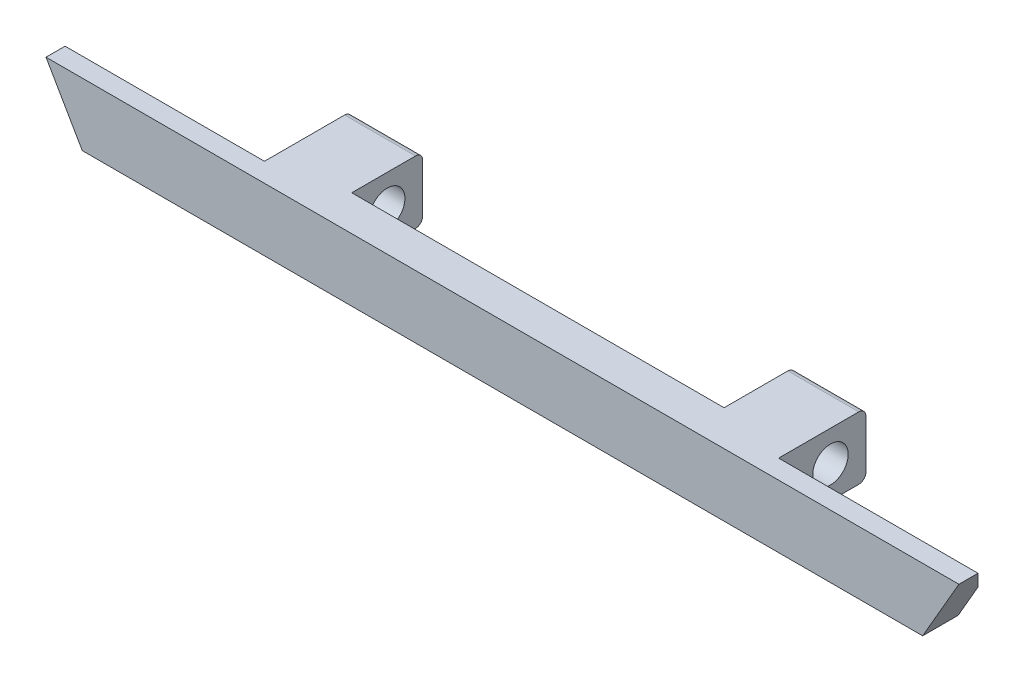
ISO-10303-21;
HEADER;
FILE_DESCRIPTION(('STEP AP214'),'2;1');
FILE_NAME('part.step','',(''),(''),'','','');
FILE_SCHEMA(('AUTOMOTIVE_DESIGN { 1 0 10303 214 1 1 1 1 }'));
ENDSEC;
DATA;
#1=APPLICATION_CONTEXT('core data for automotive mechanical design processes');
#2=APPLICATION_PROTOCOL_DEFINITION('international standard','automotive_design',2000,#1);
#3=PRODUCT_CONTEXT('',#1,'mechanical');
#4=PRODUCT('Part','Part','',(#3));
#5=PRODUCT_RELATED_PRODUCT_CATEGORY('part','',(#4));
#6=PRODUCT_DEFINITION_FORMATION('','',#4);
#7=PRODUCT_DEFINITION_CONTEXT('part definition',#1,'design');
#8=PRODUCT_DEFINITION('design','',#6,#7);
#9=PRODUCT_DEFINITION_SHAPE('','',#8);
#10=(LENGTH_UNIT() NAMED_UNIT(*) SI_UNIT(.MILLI.,.METRE.));
#11=(NAMED_UNIT(*) PLANE_ANGLE_UNIT() SI_UNIT($,.RADIAN.));
#12=(NAMED_UNIT(*) SI_UNIT($,.STERADIAN.) SOLID_ANGLE_UNIT());
#13=UNCERTAINTY_MEASURE_WITH_UNIT(LENGTH_MEASURE(1.E-05),#10,'distance_accuracy_value','');
#14=(GEOMETRIC_REPRESENTATION_CONTEXT(3) GLOBAL_UNCERTAINTY_ASSIGNED_CONTEXT((#13)) GLOBAL_UNIT_ASSIGNED_CONTEXT((#10,
#11,#12)) REPRESENTATION_CONTEXT('',''));
#15=CARTESIAN_POINT('',(0.,0.,0.));
#16=DIRECTION('',(0.,0.,1.));
#17=DIRECTION('',(1.,0.,0.));
#18=AXIS2_PLACEMENT_3D('',#15,#16,#17);
#19=CARTESIAN_POINT('',(0.,0.,0.));
#20=DIRECTION('',(0.,0.,1.));
#21=DIRECTION('',(1.,0.,0.));
#22=AXIS2_PLACEMENT_3D('',#19,#20,#21);
#23=PLANE('',#22);
#24=DIRECTION('',(0.,-1.,0.));
#25=VECTOR('',#24,1.);
#26=CARTESIAN_POINT('',(362.5,0.,0.));
#27=LINE('',#26,#25);
#28=CARTESIAN_POINT('',(362.5,48.5597577909953,0.));
#29=VERTEX_POINT('',#28);
#30=CARTESIAN_POINT('',(362.5,0.,0.));
#31=VERTEX_POINT('',#30);
#32=EDGE_CURVE('E160',#29,#31,#27,.T.);
#33=ORIENTED_EDGE('',*,*,#32,.F.);
#34=DIRECTION('',(1.,0.,0.));
#35=VECTOR('',#34,1.);
#36=CARTESIAN_POINT('',(0.,48.5597577909953,0.));
#37=LINE('',#36,#35);
#38=CARTESIAN_POINT('',(620.535989232415,48.5597577909953,0.));
#39=VERTEX_POINT('',#38);
#40=EDGE_CURVE('E53',#29,#39,#37,.T.);
#41=ORIENTED_EDGE('',*,*,#40,.T.);
#42=DIRECTION('',(0.500000000000004,0.866025403784436,0.));
#43=VECTOR('',#42,1.);
#44=CARTESIAN_POINT('',(592.5,0.,0.));
#45=LINE('',#44,#43);
#46=CARTESIAN_POINT('',(592.5,0.,0.));
#47=VERTEX_POINT('',#46);
#48=EDGE_CURVE('E180',#47,#39,#45,.T.);
#49=ORIENTED_EDGE('',*,*,#48,.F.);
#50=DIRECTION('',(1.,0.,0.));
#51=VECTOR('',#50,1.);
#52=CARTESIAN_POINT('',(0.,0.,0.));
#53=LINE('',#52,#51);
#54=EDGE_CURVE('E173',#31,#47,#53,.T.);
#55=ORIENTED_EDGE('',*,*,#54,.F.);
#56=EDGE_LOOP('',(#33,#41,#49,#55));
#57=FACE_BOUND('',#56,.T.);
#58=ADVANCED_FACE('F37',(#57),#23,.F.);
#59=DIRECTION('',(-1.,0.,0.));
#60=VECTOR('',#59,1.);
#61=CARTESIAN_POINT('',(643.63,88.5597577909956,0.));
#62=LINE('',#61,#60);
#63=CARTESIAN_POINT('',(262.5,88.5597577909956,0.));
#64=VERTEX_POINT('',#63);
#65=CARTESIAN_POINT('',(-262.5,88.5597577909956,0.));
#66=VERTEX_POINT('',#65);
#67=EDGE_CURVE('E194',#64,#66,#62,.T.);
#68=ORIENTED_EDGE('',*,*,#67,.F.);
#69=DIRECTION('',(0.,-1.,0.));
#70=VECTOR('',#69,1.);
#71=CARTESIAN_POINT('',(262.5,0.,0.));
#72=LINE('',#71,#70);
#73=CARTESIAN_POINT('',(262.5,0.,0.));
#74=VERTEX_POINT('',#73);
#75=EDGE_CURVE('E167',#64,#74,#72,.T.);
#76=ORIENTED_EDGE('',*,*,#75,.T.);
#77=CARTESIAN_POINT('',(-262.5,0.,0.));
#78=VERTEX_POINT('',#77);
#79=EDGE_CURVE('E181',#78,#74,#53,.T.);
#80=ORIENTED_EDGE('',*,*,#79,.F.);
#81=DIRECTION('',(0.,-1.,0.));
#82=VECTOR('',#81,1.);
#83=CARTESIAN_POINT('',(-262.5,1.64540617111836E-13,0.));
#84=LINE('',#83,#82);
#85=EDGE_CURVE('E297',#66,#78,#84,.T.);
#86=ORIENTED_EDGE('',*,*,#85,.F.);
#87=EDGE_LOOP('',(#68,#76,#80,#86));
#88=FACE_BOUND('',#87,.T.);
#89=ADVANCED_FACE('F346',(#88),#23,.F.);
#90=CARTESIAN_POINT('',(0.,0.,50.));
#91=DIRECTION('',(0.,1.,0.));
#92=DIRECTION('',(0.,0.,1.));
#93=AXIS2_PLACEMENT_3D('',#90,#91,#92);
#94=PLANE('',#93);
#95=DIRECTION('',(0.,0.,1.));
#96=VECTOR('',#95,1.);
#97=CARTESIAN_POINT('',(262.5,0.,-100.));
#98=LINE('',#97,#96);
#99=CARTESIAN_POINT('',(262.5,0.,-90.));
#100=VERTEX_POINT('',#99);
#101=EDGE_CURVE('E178',#100,#74,#98,.T.);
#102=ORIENTED_EDGE('',*,*,#101,.F.);
#103=DIRECTION('',(-1.,0.,0.));
#104=VECTOR('',#103,1.);
#105=CARTESIAN_POINT('',(362.5,0.,-90.));
#106=LINE('',#105,#104);
#107=CARTESIAN_POINT('',(362.5,0.,-90.));
#108=VERTEX_POINT('',#107);
#109=EDGE_CURVE('E176',#100,#108,#106,.F.);
#110=ORIENTED_EDGE('',*,*,#109,.T.);
#111=DIRECTION('',(0.,0.,1.));
#112=VECTOR('',#111,1.);
#113=CARTESIAN_POINT('',(362.5,0.,-100.));
#114=LINE('',#113,#112);
#115=EDGE_CURVE('E163',#108,#31,#114,.T.);
#116=ORIENTED_EDGE('',*,*,#115,.T.);
#117=ORIENTED_EDGE('',*,*,#54,.T.);
#118=DIRECTION('',(0.,0.,-1.));
#119=VECTOR('',#118,1.);
#120=CARTESIAN_POINT('',(592.5,0.,50.));
#121=LINE('',#120,#119);
#122=CARTESIAN_POINT('',(592.5,0.,50.));
#123=VERTEX_POINT('',#122);
#124=EDGE_CURVE('E212',#123,#47,#121,.T.);
#125=ORIENTED_EDGE('',*,*,#124,.F.);
#126=DIRECTION('',(1.,0.,0.));
#127=VECTOR('',#126,1.);
#128=CARTESIAN_POINT('',(-592.5,0.,50.));
#129=LINE('',#128,#127);
#130=CARTESIAN_POINT('',(-592.5,0.,50.));
#131=VERTEX_POINT('',#130);
#132=EDGE_CURVE('E202',#131,#123,#129,.T.);
#133=ORIENTED_EDGE('',*,*,#132,.F.);
#134=DIRECTION('',(0.,0.,-1.));
#135=VECTOR('',#134,1.);
#136=CARTESIAN_POINT('',(-592.5,0.,50.));
#137=LINE('',#136,#135);
#138=CARTESIAN_POINT('',(-592.5,0.,0.));
#139=VERTEX_POINT('',#138);
#140=EDGE_CURVE('E203',#131,#139,#137,.T.);
#141=ORIENTED_EDGE('',*,*,#140,.T.);
#142=CARTESIAN_POINT('',(-362.5,0.,0.));
#143=VERTEX_POINT('',#142);
#144=EDGE_CURVE('E184',#139,#143,#53,.T.);
#145=ORIENTED_EDGE('',*,*,#144,.T.);
#146=DIRECTION('',(0.,0.,1.));
#147=VECTOR('',#146,1.);
#148=CARTESIAN_POINT('',(-362.5,0.,-100.));
#149=LINE('',#148,#147);
#150=CARTESIAN_POINT('',(-362.5,0.,-90.));
#151=VERTEX_POINT('',#150);
#152=EDGE_CURVE('E294',#151,#143,#149,.T.);
#153=ORIENTED_EDGE('',*,*,#152,.F.);
#154=DIRECTION('',(-1.,0.,0.));
#155=VECTOR('',#154,1.);
#156=CARTESIAN_POINT('',(-262.5,0.,-90.));
#157=LINE('',#156,#155);
#158=CARTESIAN_POINT('',(-262.5,0.,-90.));
#159=VERTEX_POINT('',#158);
#160=EDGE_CURVE('E224',#151,#159,#157,.F.);
#161=ORIENTED_EDGE('',*,*,#160,.T.);
#162=DIRECTION('',(0.,0.,1.));
#163=VECTOR('',#162,1.);
#164=CARTESIAN_POINT('',(-262.5,0.,-100.));
#165=LINE('',#164,#163);
#166=EDGE_CURVE('E292',#159,#78,#165,.T.);
#167=ORIENTED_EDGE('',*,*,#166,.T.);
#168=ORIENTED_EDGE('',*,*,#79,.T.);
#169=EDGE_LOOP('',(#102,#110,#116,#117,#125,#133,#141,#145,#153,#161,#167,#168));
#170=FACE_BOUND('',#169,.T.);
#171=ADVANCED_FACE('F171',(#170),#94,.F.);
#172=CARTESIAN_POINT('',(592.5,0.,50.));
#173=DIRECTION('',(-0.866025403784436,0.500000000000004,0.));
#174=DIRECTION('',(-0.500000000000004,-0.866025403784436,0.));
#175=AXIS2_PLACEMENT_3D('',#172,#173,#174);
#176=PLANE('',#175);
#177=ORIENTED_EDGE('',*,*,#48,.T.);
#178=DIRECTION('',(-0.447213595499962,-0.774596669241483,-0.447213595499954));
#179=VECTOR('',#178,1.);
#180=CARTESIAN_POINT('',(643.63,88.5597577909956,23.094010767585));
#181=LINE('',#180,#179);
#182=CARTESIAN_POINT('',(643.63,88.5597577909956,23.094010767585));
#183=VERTEX_POINT('',#182);
#184=EDGE_CURVE('E260',#39,#183,#181,.F.);
#185=ORIENTED_EDGE('',*,*,#184,.T.);
#186=DIRECTION('',(0.,0.,-1.));
#187=VECTOR('',#186,1.);
#188=CARTESIAN_POINT('',(643.63,88.5597577909956,50.));
#189=LINE('',#188,#187);
#190=CARTESIAN_POINT('',(643.63,88.5597577909956,50.));
#191=VERTEX_POINT('',#190);
#192=EDGE_CURVE('E209',#191,#183,#189,.T.);
#193=ORIENTED_EDGE('',*,*,#192,.F.);
#194=DIRECTION('',(0.500000000000004,0.866025403784436,0.));
#195=VECTOR('',#194,1.);
#196=CARTESIAN_POINT('',(592.5,0.,50.));
#197=LINE('',#196,#195);
#198=EDGE_CURVE('E286',#123,#191,#197,.T.);
#199=ORIENTED_EDGE('',*,*,#198,.F.);
#200=ORIENTED_EDGE('',*,*,#124,.T.);
#201=EDGE_LOOP('',(#177,#185,#193,#199,#200));
#202=FACE_BOUND('',#201,.T.);
#203=ADVANCED_FACE('F367',(#202),#176,.F.);
#204=CARTESIAN_POINT('',(643.63,88.5597577909956,50.));
#205=DIRECTION('',(0.,-1.,0.));
#206=DIRECTION('',(1.,0.,0.));
#207=AXIS2_PLACEMENT_3D('',#204,#205,#206);
#208=PLANE('',#207);
#209=DIRECTION('',(0.,0.,1.));
#210=VECTOR('',#209,1.);
#211=CARTESIAN_POINT('',(-362.5,88.5597577909956,-100.));
#212=LINE('',#211,#210);
#213=CARTESIAN_POINT('',(-362.5,88.5597577909956,-90.));
#214=VERTEX_POINT('',#213);
#215=CARTESIAN_POINT('',(-362.5,88.5597577909956,23.094010767585));
#216=VERTEX_POINT('',#215);
#217=EDGE_CURVE('E182',#214,#216,#212,.T.);
#218=ORIENTED_EDGE('',*,*,#217,.T.);
#219=DIRECTION('',(-1.,0.,0.));
#220=VECTOR('',#219,1.);
#221=CARTESIAN_POINT('',(643.63,88.5597577909956,23.094010767585));
#222=LINE('',#221,#220);
#223=CARTESIAN_POINT('',(-643.63,88.5597577909956,23.094010767585));
#224=VERTEX_POINT('',#223);
#225=EDGE_CURVE('E252',#216,#224,#222,.T.);
#226=ORIENTED_EDGE('',*,*,#225,.T.);
#227=DIRECTION('',(0.,0.,-1.));
#228=VECTOR('',#227,1.);
#229=CARTESIAN_POINT('',(-643.63,88.5597577909956,50.));
#230=LINE('',#229,#228);
#231=CARTESIAN_POINT('',(-643.63,88.5597577909956,50.));
#232=VERTEX_POINT('',#231);
#233=EDGE_CURVE('E205',#232,#224,#230,.T.);
#234=ORIENTED_EDGE('',*,*,#233,.F.);
#235=DIRECTION('',(-1.,0.,0.));
#236=VECTOR('',#235,1.);
#237=CARTESIAN_POINT('',(643.63,88.5597577909956,50.));
#238=LINE('',#237,#236);
#239=EDGE_CURVE('E285',#191,#232,#238,.T.);
#240=ORIENTED_EDGE('',*,*,#239,.F.);
#241=ORIENTED_EDGE('',*,*,#192,.T.);
#242=DIRECTION('',(-1.,0.,0.));
#243=VECTOR('',#242,1.);
#244=CARTESIAN_POINT('',(643.63,88.5597577909956,23.094010767585));
#245=LINE('',#244,#243);
#246=CARTESIAN_POINT('',(362.5,88.5597577909956,23.094010767585));
#247=VERTEX_POINT('',#246);
#248=EDGE_CURVE('E249',#183,#247,#245,.T.);
#249=ORIENTED_EDGE('',*,*,#248,.T.);
#250=DIRECTION('',(0.,0.,1.));
#251=VECTOR('',#250,1.);
#252=CARTESIAN_POINT('',(362.5,88.5597577909956,-100.));
#253=LINE('',#252,#251);
#254=CARTESIAN_POINT('',(362.5,88.5597577909956,-90.));
#255=VERTEX_POINT('',#254);
#256=EDGE_CURVE('E177',#255,#247,#253,.T.);
#257=ORIENTED_EDGE('',*,*,#256,.F.);
#258=DIRECTION('',(1.,0.,0.));
#259=VECTOR('',#258,1.);
#260=CARTESIAN_POINT('',(262.5,88.5597577909956,-90.));
#261=LINE('',#260,#259);
#262=CARTESIAN_POINT('',(262.5,88.5597577909956,-90.));
#263=VERTEX_POINT('',#262);
#264=EDGE_CURVE('E233',#255,#263,#261,.F.);
#265=ORIENTED_EDGE('',*,*,#264,.T.);
#266=DIRECTION('',(0.,0.,1.));
#267=VECTOR('',#266,1.);
#268=CARTESIAN_POINT('',(262.5,88.5597577909956,-100.));
#269=LINE('',#268,#267);
#270=EDGE_CURVE('E302',#263,#64,#269,.T.);
#271=ORIENTED_EDGE('',*,*,#270,.T.);
#272=ORIENTED_EDGE('',*,*,#67,.T.);
#273=DIRECTION('',(0.,0.,1.));
#274=VECTOR('',#273,1.);
#275=CARTESIAN_POINT('',(-262.5,88.5597577909956,-100.));
#276=LINE('',#275,#274);
#277=CARTESIAN_POINT('',(-262.5,88.5597577909956,-90.));
#278=VERTEX_POINT('',#277);
#279=EDGE_CURVE('E186',#278,#66,#276,.T.);
#280=ORIENTED_EDGE('',*,*,#279,.F.);
#281=DIRECTION('',(1.,0.,0.));
#282=VECTOR('',#281,1.);
#283=CARTESIAN_POINT('',(-362.5,88.5597577909956,-90.));
#284=LINE('',#283,#282);
#285=EDGE_CURVE('E231',#278,#214,#284,.F.);
#286=ORIENTED_EDGE('',*,*,#285,.T.);
#287=EDGE_LOOP('',(#218,#226,#234,#240,#241,#249,#257,#265,#271,#272,#280,#286));
#288=FACE_BOUND('',#287,.T.);
#289=ADVANCED_FACE('F276',(#288),#208,.F.);
#290=CARTESIAN_POINT('',(-643.63,88.5597577909956,50.));
#291=DIRECTION('',(0.866025403784436,0.500000000000004,0.));
#292=DIRECTION('',(-0.500000000000004,0.866025403784436,0.));
#293=AXIS2_PLACEMENT_3D('',#290,#291,#292);
#294=PLANE('',#293);
#295=ORIENTED_EDGE('',*,*,#233,.T.);
#296=DIRECTION('',(-0.447213595499962,0.774596669241483,0.447213595499954));
#297=VECTOR('',#296,1.);
#298=CARTESIAN_POINT('',(-386.177999999995,-357.360186719231,-234.357989232415));
#299=LINE('',#298,#297);
#300=CARTESIAN_POINT('',(-620.535989232415,48.5597577909953,0.));
#301=VERTEX_POINT('',#300);
#302=EDGE_CURVE('E255',#224,#301,#299,.F.);
#303=ORIENTED_EDGE('',*,*,#302,.T.);
#304=DIRECTION('',(0.500000000000004,-0.866025403784436,0.));
#305=VECTOR('',#304,1.);
#306=CARTESIAN_POINT('',(-643.63,88.5597577909956,0.));
#307=LINE('',#306,#305);
#308=EDGE_CURVE('E198',#301,#139,#307,.T.);
#309=ORIENTED_EDGE('',*,*,#308,.T.);
#310=ORIENTED_EDGE('',*,*,#140,.F.);
#311=DIRECTION('',(0.500000000000004,-0.866025403784436,0.));
#312=VECTOR('',#311,1.);
#313=CARTESIAN_POINT('',(-643.63,88.5597577909956,50.));
#314=LINE('',#313,#312);
#315=EDGE_CURVE('E206',#232,#131,#314,.T.);
#316=ORIENTED_EDGE('',*,*,#315,.F.);
#317=EDGE_LOOP('',(#295,#303,#309,#310,#316));
#318=FACE_BOUND('',#317,.T.);
#319=ADVANCED_FACE('F280',(#318),#294,.F.);
#320=CARTESIAN_POINT('',(0.,0.,50.));
#321=DIRECTION('',(0.,0.,1.));
#322=DIRECTION('',(1.,0.,0.));
#323=AXIS2_PLACEMENT_3D('',#320,#321,#322);
#324=PLANE('',#323);
#325=ORIENTED_EDGE('',*,*,#132,.T.);
#326=ORIENTED_EDGE('',*,*,#198,.T.);
#327=ORIENTED_EDGE('',*,*,#239,.T.);
#328=ORIENTED_EDGE('',*,*,#315,.T.);
#329=EDGE_LOOP('',(#325,#326,#327,#328));
#330=FACE_BOUND('',#329,.T.);
#331=ADVANCED_FACE('F356',(#330),#324,.T.);
#332=ORIENTED_EDGE('',*,*,#308,.F.);
#333=DIRECTION('',(1.,0.,0.));
#334=VECTOR('',#333,1.);
#335=CARTESIAN_POINT('',(0.,48.5597577909953,0.));
#336=LINE('',#335,#334);
#337=CARTESIAN_POINT('',(-362.5,48.5597577909953,0.));
#338=VERTEX_POINT('',#337);
#339=EDGE_CURVE('E257',#301,#338,#336,.T.);
#340=ORIENTED_EDGE('',*,*,#339,.T.);
#341=DIRECTION('',(0.,-1.,0.));
#342=VECTOR('',#341,1.);
#343=CARTESIAN_POINT('',(-362.5,0.,0.));
#344=LINE('',#343,#342);
#345=EDGE_CURVE('E270',#338,#143,#344,.T.);
#346=ORIENTED_EDGE('',*,*,#345,.T.);
#347=ORIENTED_EDGE('',*,*,#144,.F.);
#348=EDGE_LOOP('',(#332,#340,#346,#347));
#349=FACE_BOUND('',#348,.T.);
#350=ADVANCED_FACE('F348',(#349),#23,.F.);
#351=CARTESIAN_POINT('',(-362.5,0.,-100.));
#352=DIRECTION('',(-1.,0.,0.));
#353=DIRECTION('',(0.,0.,1.));
#354=AXIS2_PLACEMENT_3D('',#351,#352,#353);
#355=PLANE('',#354);
#356=CARTESIAN_POINT('',(-362.5,44.279878895498,-50.));
#357=DIRECTION('',(-1.,0.,0.));
#358=DIRECTION('',(0.,0.,1.));
#359=AXIS2_PLACEMENT_3D('',#356,#357,#358);
#360=CIRCLE('',#359,25.);
#361=CARTESIAN_POINT('',(-362.5,44.279878895498,-25.));
#362=VERTEX_POINT('',#361);
#363=EDGE_CURVE('E313',#362,#362,#360,.T.);
#364=ORIENTED_EDGE('',*,*,#363,.F.);
#365=EDGE_LOOP('',(#364));
#366=FACE_BOUND('',#365,.T.);
#367=ORIENTED_EDGE('',*,*,#217,.F.);
#368=CARTESIAN_POINT('',(-362.5,78.5597577909956,-90.));
#369=DIRECTION('',(-1.,0.,0.));
#370=DIRECTION('',(0.,0.,1.));
#371=AXIS2_PLACEMENT_3D('',#368,#369,#370);
#372=CIRCLE('',#371,10.);
#373=CARTESIAN_POINT('',(-362.5,78.5597577909956,-100.));
#374=VERTEX_POINT('',#373);
#375=EDGE_CURVE('E247',#214,#374,#372,.T.);
#376=ORIENTED_EDGE('',*,*,#375,.T.);
#377=DIRECTION('',(0.,-1.,0.));
#378=VECTOR('',#377,1.);
#379=CARTESIAN_POINT('',(-362.5,0.,-100.));
#380=LINE('',#379,#378);
#381=CARTESIAN_POINT('',(-362.5,10.,-100.));
#382=VERTEX_POINT('',#381);
#383=EDGE_CURVE('E300',#374,#382,#380,.T.);
#384=ORIENTED_EDGE('',*,*,#383,.T.);
#385=CARTESIAN_POINT('',(-362.5,10.,-90.));
#386=DIRECTION('',(-1.,0.,0.));
#387=DIRECTION('',(0.,0.,1.));
#388=AXIS2_PLACEMENT_3D('',#385,#386,#387);
#389=CIRCLE('',#388,10.);
#390=EDGE_CURVE('E245',#382,#151,#389,.T.);
#391=ORIENTED_EDGE('',*,*,#390,.T.);
#392=ORIENTED_EDGE('',*,*,#152,.T.);
#393=ORIENTED_EDGE('',*,*,#345,.F.);
#394=DIRECTION('',(0.,-0.86602540378444,-0.499999999999997));
#395=VECTOR('',#394,1.);
#396=CARTESIAN_POINT('',(-362.5,88.5597577909956,23.094010767585));
#397=LINE('',#396,#395);
#398=EDGE_CURVE('E46',#338,#216,#397,.F.);
#399=ORIENTED_EDGE('',*,*,#398,.T.);
#400=EDGE_LOOP('',(#367,#376,#384,#391,#392,#393,#399));
#401=FACE_BOUND('',#400,.T.);
#402=ADVANCED_FACE('F267',(#366,#401),#355,.T.);
#403=CARTESIAN_POINT('',(-262.5,1.64540617111836E-13,-100.));
#404=DIRECTION('',(-1.,0.,0.));
#405=DIRECTION('',(0.,-1.,0.));
#406=AXIS2_PLACEMENT_3D('',#403,#404,#405);
#407=PLANE('',#406);
#408=CARTESIAN_POINT('',(-262.5,44.279878895498,-50.));
#409=DIRECTION('',(-1.,0.,0.));
#410=DIRECTION('',(0.,-1.,0.));
#411=AXIS2_PLACEMENT_3D('',#408,#409,#410);
#412=CIRCLE('',#411,25.);
#413=CARTESIAN_POINT('',(-262.5,19.279878895498,-50.));
#414=VERTEX_POINT('',#413);
#415=EDGE_CURVE('E320',#414,#414,#412,.T.);
#416=ORIENTED_EDGE('',*,*,#415,.T.);
#417=EDGE_LOOP('',(#416));
#418=FACE_BOUND('',#417,.T.);
#419=DIRECTION('',(0.,-1.,0.));
#420=VECTOR('',#419,1.);
#421=CARTESIAN_POINT('',(-262.5,1.64540617111836E-13,-100.));
#422=LINE('',#421,#420);
#423=CARTESIAN_POINT('',(-262.5,78.5597577909956,-100.));
#424=VERTEX_POINT('',#423);
#425=CARTESIAN_POINT('',(-262.5,10.,-100.));
#426=VERTEX_POINT('',#425);
#427=EDGE_CURVE('E296',#424,#426,#422,.T.);
#428=ORIENTED_EDGE('',*,*,#427,.F.);
#429=CARTESIAN_POINT('',(-262.5,78.5597577909956,-90.));
#430=DIRECTION('',(-1.,0.,0.));
#431=DIRECTION('',(0.,-1.,0.));
#432=AXIS2_PLACEMENT_3D('',#429,#430,#431);
#433=CIRCLE('',#432,10.);
#434=EDGE_CURVE('E243',#424,#278,#433,.F.);
#435=ORIENTED_EDGE('',*,*,#434,.T.);
#436=ORIENTED_EDGE('',*,*,#279,.T.);
#437=ORIENTED_EDGE('',*,*,#85,.T.);
#438=ORIENTED_EDGE('',*,*,#166,.F.);
#439=CARTESIAN_POINT('',(-262.5,10.,-90.));
#440=DIRECTION('',(-1.,0.,0.));
#441=DIRECTION('',(0.,-1.,0.));
#442=AXIS2_PLACEMENT_3D('',#439,#440,#441);
#443=CIRCLE('',#442,10.);
#444=EDGE_CURVE('E241',#159,#426,#443,.F.);
#445=ORIENTED_EDGE('',*,*,#444,.T.);
#446=EDGE_LOOP('',(#428,#435,#436,#437,#438,#445));
#447=FACE_BOUND('',#446,.T.);
#448=ADVANCED_FACE('F362',(#418,#447),#407,.F.);
#449=CARTESIAN_POINT('',(0.,0.,-100.));
#450=DIRECTION('',(0.,0.,-1.));
#451=DIRECTION('',(-1.,0.,0.));
#452=AXIS2_PLACEMENT_3D('',#449,#450,#451);
#453=PLANE('',#452);
#454=ORIENTED_EDGE('',*,*,#383,.F.);
#455=DIRECTION('',(1.,0.,0.));
#456=VECTOR('',#455,1.);
#457=CARTESIAN_POINT('',(-262.5,78.5597577909956,-100.));
#458=LINE('',#457,#456);
#459=EDGE_CURVE('E238',#374,#424,#458,.T.);
#460=ORIENTED_EDGE('',*,*,#459,.T.);
#461=ORIENTED_EDGE('',*,*,#427,.T.);
#462=DIRECTION('',(-1.,0.,0.));
#463=VECTOR('',#462,1.);
#464=CARTESIAN_POINT('',(-362.5,10.,-100.));
#465=LINE('',#464,#463);
#466=EDGE_CURVE('E235',#426,#382,#465,.T.);
#467=ORIENTED_EDGE('',*,*,#466,.T.);
#468=EDGE_LOOP('',(#454,#460,#461,#467));
#469=FACE_BOUND('',#468,.T.);
#470=ADVANCED_FACE('F342',(#469),#453,.T.);
#471=CARTESIAN_POINT('',(262.5,0.,-100.));
#472=DIRECTION('',(-1.,0.,0.));
#473=DIRECTION('',(0.,0.,1.));
#474=AXIS2_PLACEMENT_3D('',#471,#472,#473);
#475=PLANE('',#474);
#476=CARTESIAN_POINT('',(262.5,44.279878895498,-50.));
#477=DIRECTION('',(-1.,0.,0.));
#478=DIRECTION('',(0.,0.,1.));
#479=AXIS2_PLACEMENT_3D('',#476,#477,#478);
#480=CIRCLE('',#479,25.);
#481=CARTESIAN_POINT('',(262.5,44.279878895498,-25.));
#482=VERTEX_POINT('',#481);
#483=EDGE_CURVE('E323',#482,#482,#480,.T.);
#484=ORIENTED_EDGE('',*,*,#483,.F.);
#485=EDGE_LOOP('',(#484));
#486=FACE_BOUND('',#485,.T.);
#487=DIRECTION('',(0.,-1.,0.));
#488=VECTOR('',#487,1.);
#489=CARTESIAN_POINT('',(262.5,0.,-100.));
#490=LINE('',#489,#488);
#491=CARTESIAN_POINT('',(262.5,78.5597577909956,-100.));
#492=VERTEX_POINT('',#491);
#493=CARTESIAN_POINT('',(262.5,10.,-100.));
#494=VERTEX_POINT('',#493);
#495=EDGE_CURVE('E166',#492,#494,#490,.T.);
#496=ORIENTED_EDGE('',*,*,#495,.T.);
#497=CARTESIAN_POINT('',(262.5,10.,-90.));
#498=DIRECTION('',(-1.,0.,0.));
#499=DIRECTION('',(0.,0.,1.));
#500=AXIS2_PLACEMENT_3D('',#497,#498,#499);
#501=CIRCLE('',#500,10.);
#502=EDGE_CURVE('E222',#494,#100,#501,.T.);
#503=ORIENTED_EDGE('',*,*,#502,.T.);
#504=ORIENTED_EDGE('',*,*,#101,.T.);
#505=ORIENTED_EDGE('',*,*,#75,.F.);
#506=ORIENTED_EDGE('',*,*,#270,.F.);
#507=CARTESIAN_POINT('',(262.5,78.5597577909956,-90.));
#508=DIRECTION('',(-1.,0.,0.));
#509=DIRECTION('',(0.,0.,1.));
#510=AXIS2_PLACEMENT_3D('',#507,#508,#509);
#511=CIRCLE('',#510,10.);
#512=EDGE_CURVE('E220',#263,#492,#511,.T.);
#513=ORIENTED_EDGE('',*,*,#512,.T.);
#514=EDGE_LOOP('',(#496,#503,#504,#505,#506,#513));
#515=FACE_BOUND('',#514,.T.);
#516=ADVANCED_FACE('F334',(#486,#515),#475,.T.);
#517=CARTESIAN_POINT('',(362.5,0.,-100.));
#518=DIRECTION('',(-1.,0.,0.));
#519=DIRECTION('',(0.,0.,1.));
#520=AXIS2_PLACEMENT_3D('',#517,#518,#519);
#521=PLANE('',#520);
#522=CARTESIAN_POINT('',(362.5,44.279878895498,-50.));
#523=DIRECTION('',(1.,0.,0.));
#524=DIRECTION('',(0.,0.,-1.));
#525=AXIS2_PLACEMENT_3D('',#522,#523,#524);
#526=CIRCLE('',#525,25.);
#527=CARTESIAN_POINT('',(362.5,44.279878895498,-75.));
#528=VERTEX_POINT('',#527);
#529=EDGE_CURVE('E326',#528,#528,#526,.T.);
#530=ORIENTED_EDGE('',*,*,#529,.F.);
#531=EDGE_LOOP('',(#530));
#532=FACE_BOUND('',#531,.T.);
#533=ORIENTED_EDGE('',*,*,#115,.F.);
#534=CARTESIAN_POINT('',(362.5,10.,-90.));
#535=DIRECTION('',(-1.,0.,0.));
#536=DIRECTION('',(0.,0.,1.));
#537=AXIS2_PLACEMENT_3D('',#534,#535,#536);
#538=CIRCLE('',#537,10.);
#539=CARTESIAN_POINT('',(362.5,10.,-100.));
#540=VERTEX_POINT('',#539);
#541=EDGE_CURVE('E229',#108,#540,#538,.F.);
#542=ORIENTED_EDGE('',*,*,#541,.T.);
#543=DIRECTION('',(0.,-1.,0.));
#544=VECTOR('',#543,1.);
#545=CARTESIAN_POINT('',(362.5,0.,-100.));
#546=LINE('',#545,#544);
#547=CARTESIAN_POINT('',(362.5,78.5597577909956,-100.));
#548=VERTEX_POINT('',#547);
#549=EDGE_CURVE('E309',#548,#540,#546,.T.);
#550=ORIENTED_EDGE('',*,*,#549,.F.);
#551=CARTESIAN_POINT('',(362.5,78.5597577909956,-90.));
#552=DIRECTION('',(-1.,0.,0.));
#553=DIRECTION('',(0.,0.,1.));
#554=AXIS2_PLACEMENT_3D('',#551,#552,#553);
#555=CIRCLE('',#554,10.);
#556=EDGE_CURVE('E227',#548,#255,#555,.F.);
#557=ORIENTED_EDGE('',*,*,#556,.T.);
#558=ORIENTED_EDGE('',*,*,#256,.T.);
#559=DIRECTION('',(0.,0.86602540378444,0.499999999999997));
#560=VECTOR('',#559,1.);
#561=CARTESIAN_POINT('',(362.5,-31.1613307414731,-46.0269919243102));
#562=LINE('',#561,#560);
#563=EDGE_CURVE('E11',#247,#29,#562,.F.);
#564=ORIENTED_EDGE('',*,*,#563,.T.);
#565=ORIENTED_EDGE('',*,*,#32,.T.);
#566=EDGE_LOOP('',(#533,#542,#550,#557,#558,#564,#565));
#567=FACE_BOUND('',#566,.T.);
#568=ADVANCED_FACE('F162',(#532,#567),#521,.F.);
#569=CARTESIAN_POINT('',(0.,0.,-100.));
#570=DIRECTION('',(0.,0.,-1.));
#571=DIRECTION('',(-1.,0.,0.));
#572=AXIS2_PLACEMENT_3D('',#569,#570,#571);
#573=PLANE('',#572);
#574=ORIENTED_EDGE('',*,*,#549,.T.);
#575=DIRECTION('',(-1.,0.,0.));
#576=VECTOR('',#575,1.);
#577=CARTESIAN_POINT('',(262.5,10.,-100.));
#578=LINE('',#577,#576);
#579=EDGE_CURVE('E217',#540,#494,#578,.T.);
#580=ORIENTED_EDGE('',*,*,#579,.T.);
#581=ORIENTED_EDGE('',*,*,#495,.F.);
#582=DIRECTION('',(1.,0.,0.));
#583=VECTOR('',#582,1.);
#584=CARTESIAN_POINT('',(362.5,78.5597577909956,-100.));
#585=LINE('',#584,#583);
#586=EDGE_CURVE('E214',#492,#548,#585,.T.);
#587=ORIENTED_EDGE('',*,*,#586,.T.);
#588=EDGE_LOOP('',(#574,#580,#581,#587));
#589=FACE_BOUND('',#588,.T.);
#590=ADVANCED_FACE('F333',(#589),#573,.T.);
#591=CARTESIAN_POINT('',(-643.63,44.279878895498,-50.));
#592=DIRECTION('',(1.,0.,0.));
#593=DIRECTION('',(0.,0.,-1.));
#594=AXIS2_PLACEMENT_3D('',#591,#592,#593);
#595=CYLINDRICAL_SURFACE('',#594,25.);
#596=ORIENTED_EDGE('',*,*,#483,.T.);
#597=EDGE_LOOP('',(#596));
#598=FACE_BOUND('',#597,.T.);
#599=ORIENTED_EDGE('',*,*,#529,.T.);
#600=EDGE_LOOP('',(#599));
#601=FACE_BOUND('',#600,.T.);
#602=ADVANCED_FACE('F330',(#598,#601),#595,.F.);
#603=ORIENTED_EDGE('',*,*,#363,.T.);
#604=EDGE_LOOP('',(#603));
#605=FACE_BOUND('',#604,.T.);
#606=ORIENTED_EDGE('',*,*,#415,.F.);
#607=EDGE_LOOP('',(#606));
#608=FACE_BOUND('',#607,.T.);
#609=ADVANCED_FACE('F396',(#605,#608),#595,.F.);
#610=CARTESIAN_POINT('',(0.,10.,-90.));
#611=DIRECTION('',(1.,0.,0.));
#612=DIRECTION('',(0.,0.,-1.));
#613=AXIS2_PLACEMENT_3D('',#610,#611,#612);
#614=CYLINDRICAL_SURFACE('',#613,10.);
#615=ORIENTED_EDGE('',*,*,#541,.F.);
#616=ORIENTED_EDGE('',*,*,#109,.F.);
#617=ORIENTED_EDGE('',*,*,#502,.F.);
#618=ORIENTED_EDGE('',*,*,#579,.F.);
#619=EDGE_LOOP('',(#615,#616,#617,#618));
#620=FACE_BOUND('',#619,.T.);
#621=ADVANCED_FACE('F392',(#620),#614,.T.);
#622=CARTESIAN_POINT('',(0.,78.5597577909956,-90.));
#623=DIRECTION('',(-1.,0.,0.));
#624=DIRECTION('',(0.,-1.,0.));
#625=AXIS2_PLACEMENT_3D('',#622,#623,#624);
#626=CYLINDRICAL_SURFACE('',#625,10.);
#627=ORIENTED_EDGE('',*,*,#512,.F.);
#628=ORIENTED_EDGE('',*,*,#264,.F.);
#629=ORIENTED_EDGE('',*,*,#556,.F.);
#630=ORIENTED_EDGE('',*,*,#586,.F.);
#631=EDGE_LOOP('',(#627,#628,#629,#630));
#632=FACE_BOUND('',#631,.T.);
#633=ADVANCED_FACE('F388',(#632),#626,.T.);
#634=CARTESIAN_POINT('',(0.,78.5597577909956,-90.));
#635=DIRECTION('',(-1.,0.,0.));
#636=DIRECTION('',(0.,-1.,0.));
#637=AXIS2_PLACEMENT_3D('',#634,#635,#636);
#638=CYLINDRICAL_SURFACE('',#637,10.);
#639=ORIENTED_EDGE('',*,*,#375,.F.);
#640=ORIENTED_EDGE('',*,*,#285,.F.);
#641=ORIENTED_EDGE('',*,*,#434,.F.);
#642=ORIENTED_EDGE('',*,*,#459,.F.);
#643=EDGE_LOOP('',(#639,#640,#641,#642));
#644=FACE_BOUND('',#643,.T.);
#645=ADVANCED_FACE('F379',(#644),#638,.T.);
#646=CARTESIAN_POINT('',(0.,10.,-90.));
#647=DIRECTION('',(1.,0.,0.));
#648=DIRECTION('',(0.,0.,-1.));
#649=AXIS2_PLACEMENT_3D('',#646,#647,#648);
#650=CYLINDRICAL_SURFACE('',#649,10.);
#651=ORIENTED_EDGE('',*,*,#444,.F.);
#652=ORIENTED_EDGE('',*,*,#160,.F.);
#653=ORIENTED_EDGE('',*,*,#390,.F.);
#654=ORIENTED_EDGE('',*,*,#466,.F.);
#655=EDGE_LOOP('',(#651,#652,#653,#654));
#656=FACE_BOUND('',#655,.T.);
#657=ADVANCED_FACE('F375',(#656),#650,.T.);
#658=CARTESIAN_POINT('',(643.63,88.5597577909956,23.094010767585));
#659=DIRECTION('',(0.,-0.499999999999997,0.86602540378444));
#660=DIRECTION('',(-1.,0.,0.));
#661=AXIS2_PLACEMENT_3D('',#658,#659,#660);
#662=PLANE('',#661);
#663=ORIENTED_EDGE('',*,*,#398,.F.);
#664=ORIENTED_EDGE('',*,*,#339,.F.);
#665=ORIENTED_EDGE('',*,*,#302,.F.);
#666=ORIENTED_EDGE('',*,*,#225,.F.);
#667=EDGE_LOOP('',(#663,#664,#665,#666));
#668=FACE_BOUND('',#667,.T.);
#669=ADVANCED_FACE('F273',(#668),#662,.F.);
#670=CARTESIAN_POINT('',(643.63,88.5597577909956,23.094010767585));
#671=DIRECTION('',(0.,-0.499999999999997,0.86602540378444));
#672=DIRECTION('',(-1.,0.,0.));
#673=AXIS2_PLACEMENT_3D('',#670,#671,#672);
#674=PLANE('',#673);
#675=ORIENTED_EDGE('',*,*,#184,.F.);
#676=ORIENTED_EDGE('',*,*,#40,.F.);
#677=ORIENTED_EDGE('',*,*,#563,.F.);
#678=ORIENTED_EDGE('',*,*,#248,.F.);
#679=EDGE_LOOP('',(#675,#676,#677,#678));
#680=FACE_BOUND('',#679,.T.);
#681=ADVANCED_FACE('F40',(#680),#674,.F.);
#682=CLOSED_SHELL('',(#58,#89,#171,#203,#289,#319,#331,#350,#402,#448,#470,#516,#568,#590,#602,
#609,#621,#633,#645,#657,#669,#681));
#683=MANIFOLD_SOLID_BREP('B2',#682);
#684=ADVANCED_BREP_SHAPE_REPRESENTATION('',(#18,#683),#14);
#685=SHAPE_DEFINITION_REPRESENTATION(#9,#684);
ENDSEC;
END-ISO-10303-21;
